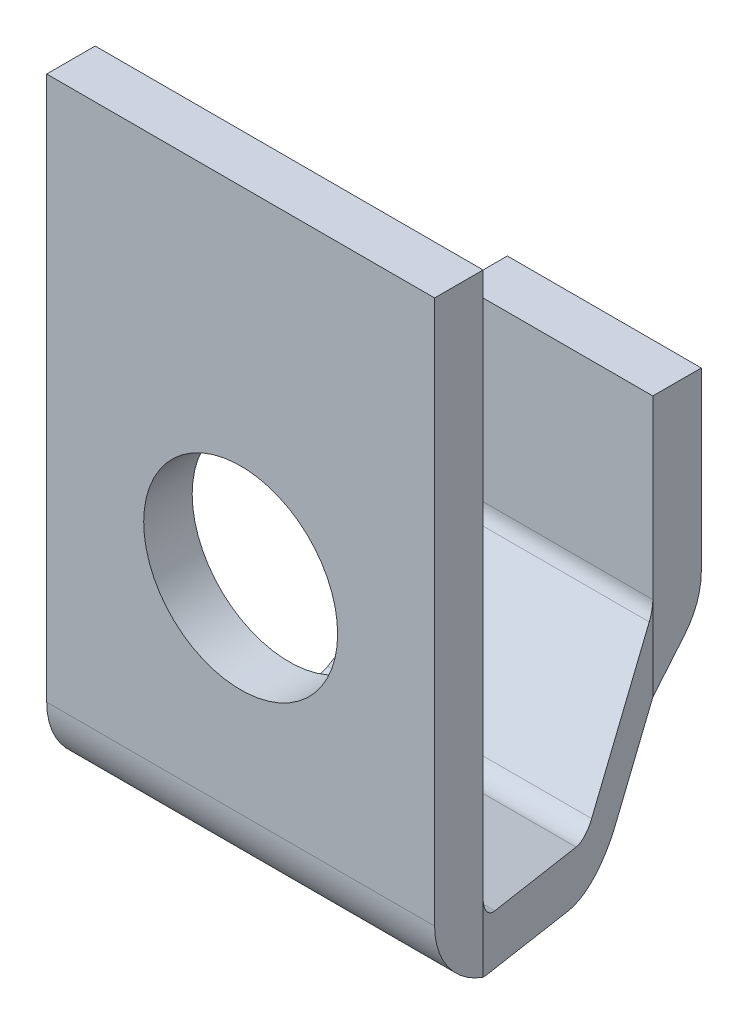
ISO-10303-21;
HEADER;
FILE_DESCRIPTION(('STEP AP214'),'2;1');
FILE_NAME('part.step','',(''),(''),'','','');
FILE_SCHEMA(('AUTOMOTIVE_DESIGN { 1 0 10303 214 1 1 1 1 }'));
ENDSEC;
DATA;
#1=APPLICATION_CONTEXT('core data for automotive mechanical design processes');
#2=APPLICATION_PROTOCOL_DEFINITION('international standard','automotive_design',2000,#1);
#3=PRODUCT_CONTEXT('',#1,'mechanical');
#4=PRODUCT('Part','Part','',(#3));
#5=PRODUCT_RELATED_PRODUCT_CATEGORY('part','',(#4));
#6=PRODUCT_DEFINITION_FORMATION('','',#4);
#7=PRODUCT_DEFINITION_CONTEXT('part definition',#1,'design');
#8=PRODUCT_DEFINITION('design','',#6,#7);
#9=PRODUCT_DEFINITION_SHAPE('','',#8);
#10=(LENGTH_UNIT() NAMED_UNIT(*) SI_UNIT(.MILLI.,.METRE.));
#11=(NAMED_UNIT(*) PLANE_ANGLE_UNIT() SI_UNIT($,.RADIAN.));
#12=(NAMED_UNIT(*) SI_UNIT($,.STERADIAN.) SOLID_ANGLE_UNIT());
#13=UNCERTAINTY_MEASURE_WITH_UNIT(LENGTH_MEASURE(1.E-05),#10,'distance_accuracy_value','');
#14=(GEOMETRIC_REPRESENTATION_CONTEXT(3) GLOBAL_UNCERTAINTY_ASSIGNED_CONTEXT((#13)) GLOBAL_UNIT_ASSIGNED_CONTEXT((#10,
#11,#12)) REPRESENTATION_CONTEXT('',''));
#15=CARTESIAN_POINT('',(0.,0.,0.));
#16=DIRECTION('',(0.,0.,1.));
#17=DIRECTION('',(1.,0.,0.));
#18=AXIS2_PLACEMENT_3D('',#15,#16,#17);
#19=CARTESIAN_POINT('',(0.,-3.,-3.25));
#20=DIRECTION('',(0.,1.,0.));
#21=DIRECTION('',(0.,0.,1.));
#22=AXIS2_PLACEMENT_3D('',#19,#20,#21);
#23=PLANE('',#22);
#24=DIRECTION('',(1.,0.,0.));
#25=VECTOR('',#24,1.);
#26=CARTESIAN_POINT('',(-2.,-3.,-3.5));
#27=LINE('',#26,#25);
#28=CARTESIAN_POINT('',(-1.,-3.,-3.5));
#29=VERTEX_POINT('',#28);
#30=CARTESIAN_POINT('',(1.,-3.,-3.5));
#31=VERTEX_POINT('',#30);
#32=EDGE_CURVE('E162',#29,#31,#27,.T.);
#33=ORIENTED_EDGE('',*,*,#32,.F.);
#34=DIRECTION('',(0.,0.,1.));
#35=VECTOR('',#34,1.);
#36=CARTESIAN_POINT('',(-1.,-3.,-3.25));
#37=LINE('',#36,#35);
#38=CARTESIAN_POINT('',(-1.,-3.,-3.));
#39=VERTEX_POINT('',#38);
#40=EDGE_CURVE('E55',#29,#39,#37,.T.);
#41=ORIENTED_EDGE('',*,*,#40,.T.);
#42=DIRECTION('',(-1.,0.,0.));
#43=VECTOR('',#42,1.);
#44=CARTESIAN_POINT('',(-2.,-3.,-3.));
#45=LINE('',#44,#43);
#46=CARTESIAN_POINT('',(1.,-3.,-3.));
#47=VERTEX_POINT('',#46);
#48=EDGE_CURVE('E167',#47,#39,#45,.T.);
#49=ORIENTED_EDGE('',*,*,#48,.F.);
#50=DIRECTION('',(0.,0.,-1.));
#51=VECTOR('',#50,1.);
#52=CARTESIAN_POINT('',(1.,-3.,-3.25));
#53=LINE('',#52,#51);
#54=EDGE_CURVE('E156',#47,#31,#53,.T.);
#55=ORIENTED_EDGE('',*,*,#54,.T.);
#56=EDGE_LOOP('',(#33,#41,#49,#55));
#57=FACE_BOUND('',#56,.T.);
#58=ADVANCED_FACE('F33',(#57),#23,.T.);
#59=CARTESIAN_POINT('',(0.,-5.60961179679779,-0.5));
#60=DIRECTION('',(1.,0.,0.));
#61=DIRECTION('',(0.,0.,-1.));
#62=AXIS2_PLACEMENT_3D('',#59,#60,#61);
#63=CYLINDRICAL_SURFACE('',#62,0.25);
#64=CARTESIAN_POINT('',(-1.90909090909091,-5.60961179679779,-0.5));
#65=DIRECTION('',(-0.939793423488437,0.,-0.341743063086704));
#66=DIRECTION('',(0.341743063086704,0.,-0.939793423488437));
#67=AXIS2_PLACEMENT_3D('',#64,#65,#66);
#68=ELLIPSE('',#67,0.26601590706181,0.25);
#69=CARTESIAN_POINT('',(-2.,-5.60961179679779,-0.25));
#70=VERTEX_POINT('',#69);
#71=CARTESIAN_POINT('',(-1.93113960227603,-5.85214742183413,-0.439366093740918));
#72=VERTEX_POINT('',#71);
#73=EDGE_CURVE('E249',#70,#72,#68,.F.);
#74=ORIENTED_EDGE('',*,*,#73,.F.);
#75=DIRECTION('',(-1.,0.,0.));
#76=VECTOR('',#75,1.);
#77=CARTESIAN_POINT('',(-2.,-5.60961179679779,-0.25));
#78=LINE('',#77,#76);
#79=CARTESIAN_POINT('',(2.,-5.60961179679779,-0.25));
#80=VERTEX_POINT('',#79);
#81=EDGE_CURVE('E225',#80,#70,#78,.T.);
#82=ORIENTED_EDGE('',*,*,#81,.F.);
#83=CARTESIAN_POINT('',(1.90909090909091,-5.60961179679779,-0.5));
#84=DIRECTION('',(0.939793423488437,0.,-0.341743063086704));
#85=DIRECTION('',(0.341743063086704,0.,0.939793423488437));
#86=AXIS2_PLACEMENT_3D('',#83,#84,#85);
#87=ELLIPSE('',#86,0.26601590706181,0.25);
#88=CARTESIAN_POINT('',(1.93113960227603,-5.85214742183413,-0.439366093740918));
#89=VERTEX_POINT('',#88);
#90=EDGE_CURVE('E267',#89,#80,#87,.F.);
#91=ORIENTED_EDGE('',*,*,#90,.F.);
#92=DIRECTION('',(-1.,0.,0.));
#93=VECTOR('',#92,1.);
#94=CARTESIAN_POINT('',(-2.,-5.85214742183413,-0.439366093740918));
#95=LINE('',#94,#93);
#96=EDGE_CURVE('E206',#89,#72,#95,.T.);
#97=ORIENTED_EDGE('',*,*,#96,.T.);
#98=EDGE_LOOP('',(#74,#82,#91,#97));
#99=FACE_BOUND('',#98,.T.);
#100=ADVANCED_FACE('F378',(#99),#63,.F.);
#101=CARTESIAN_POINT('',(0.,-5.60961179679779,-0.5));
#102=DIRECTION('',(1.,0.,0.));
#103=DIRECTION('',(0.,0.,-1.));
#104=AXIS2_PLACEMENT_3D('',#101,#102,#103);
#105=CYLINDRICAL_SURFACE('',#104,0.75);
#106=CARTESIAN_POINT('',(-1.90909090909091,-5.60961179679779,-0.5));
#107=DIRECTION('',(-0.939793423488437,0.,-0.341743063086704));
#108=DIRECTION('',(0.341743063086704,0.,-0.939793423488437));
#109=AXIS2_PLACEMENT_3D('',#106,#107,#108);
#110=ELLIPSE('',#109,0.798047721185429,0.75);
#111=CARTESIAN_POINT('',(-1.97523698864627,-6.33721867190679,-0.318098281222754));
#112=VERTEX_POINT('',#111);
#113=CARTESIAN_POINT('',(-2.,-6.31671857798434,-0.25));
#114=VERTEX_POINT('',#113);
#115=EDGE_CURVE('E240',#112,#114,#110,.T.);
#116=ORIENTED_EDGE('',*,*,#115,.F.);
#117=DIRECTION('',(1.,0.,0.));
#118=VECTOR('',#117,1.);
#119=CARTESIAN_POINT('',(-2.,-6.33721867190679,-0.318098281222754));
#120=LINE('',#119,#118);
#121=CARTESIAN_POINT('',(1.97523698864627,-6.33721867190679,-0.318098281222754));
#122=VERTEX_POINT('',#121);
#123=EDGE_CURVE('E190',#112,#122,#120,.T.);
#124=ORIENTED_EDGE('',*,*,#123,.T.);
#125=CARTESIAN_POINT('',(1.90909090909091,-5.60961179679779,-0.5));
#126=DIRECTION('',(0.939793423488437,0.,-0.341743063086704));
#127=DIRECTION('',(0.341743063086704,0.,0.939793423488437));
#128=AXIS2_PLACEMENT_3D('',#125,#126,#127);
#129=ELLIPSE('',#128,0.798047721185429,0.75);
#130=CARTESIAN_POINT('',(2.,-6.31671857798434,-0.25));
#131=VERTEX_POINT('',#130);
#132=EDGE_CURVE('E259',#131,#122,#129,.T.);
#133=ORIENTED_EDGE('',*,*,#132,.F.);
#134=CARTESIAN_POINT('',(2.,-5.60961179679779,-0.5));
#135=DIRECTION('',(1.,0.,0.));
#136=DIRECTION('',(0.,0.,1.));
#137=AXIS2_PLACEMENT_3D('',#134,#135,#136);
#138=CIRCLE('',#137,0.75);
#139=CARTESIAN_POINT('',(2.,-5.60961179679779,0.25));
#140=VERTEX_POINT('',#139);
#141=EDGE_CURVE('E197',#140,#131,#138,.T.);
#142=ORIENTED_EDGE('',*,*,#141,.F.);
#143=DIRECTION('',(1.,0.,0.));
#144=VECTOR('',#143,1.);
#145=CARTESIAN_POINT('',(-2.,-5.60961179679779,0.25));
#146=LINE('',#145,#144);
#147=CARTESIAN_POINT('',(-2.,-5.60961179679779,0.25));
#148=VERTEX_POINT('',#147);
#149=EDGE_CURVE('E194',#148,#140,#146,.T.);
#150=ORIENTED_EDGE('',*,*,#149,.F.);
#151=CARTESIAN_POINT('',(-2.,-5.60961179679779,-0.5));
#152=DIRECTION('',(1.,0.,0.));
#153=DIRECTION('',(0.,0.,1.));
#154=AXIS2_PLACEMENT_3D('',#151,#152,#153);
#155=CIRCLE('',#154,0.75);
#156=EDGE_CURVE('E193',#148,#114,#155,.T.);
#157=ORIENTED_EDGE('',*,*,#156,.T.);
#158=EDGE_LOOP('',(#116,#124,#133,#142,#150,#157));
#159=FACE_BOUND('',#158,.T.);
#160=ADVANCED_FACE('F328',(#159),#105,.T.);
#161=CARTESIAN_POINT('',(-2.,-5.85214742183413,-0.439366093740919));
#162=DIRECTION('',(0.,-0.970142500145332,0.242535625036334));
#163=DIRECTION('',(0.,-0.242535625036334,-0.970142500145332));
#164=AXIS2_PLACEMENT_3D('',#161,#162,#163);
#165=PLANE('',#164);
#166=DIRECTION('',(0.332684192827629,-0.228720382568996,-0.914881530275981));
#167=VECTOR('',#166,1.);
#168=CARTESIAN_POINT('',(-1.93876098654639,-5.84690772014826,-0.418407286997437));
#169=LINE('',#168,#167);
#170=CARTESIAN_POINT('',(-1.45230242720104,-6.18134797969818,-1.75616832519715));
#171=VERTEX_POINT('',#170);
#172=EDGE_CURVE('E251',#72,#171,#169,.T.);
#173=ORIENTED_EDGE('',*,*,#172,.F.);
#174=ORIENTED_EDGE('',*,*,#96,.F.);
#175=DIRECTION('',(0.332684192827629,0.228720382568996,0.914881530275981));
#176=VECTOR('',#175,1.);
#177=CARTESIAN_POINT('',(1.4960458979169,-6.15127434358103,-1.63587378072852));
#178=LINE('',#177,#176);
#179=CARTESIAN_POINT('',(1.45230242720104,-6.18134797969818,-1.75616832519715));
#180=VERTEX_POINT('',#179);
#181=EDGE_CURVE('E269',#180,#89,#178,.T.);
#182=ORIENTED_EDGE('',*,*,#181,.F.);
#183=DIRECTION('',(-1.,0.,0.));
#184=VECTOR('',#183,1.);
#185=CARTESIAN_POINT('',(-2.,-6.18134797969818,-1.75616832519715));
#186=LINE('',#185,#184);
#187=EDGE_CURVE('E189',#180,#171,#186,.T.);
#188=ORIENTED_EDGE('',*,*,#187,.T.);
#189=EDGE_LOOP('',(#173,#174,#182,#188));
#190=FACE_BOUND('',#189,.T.);
#191=ADVANCED_FACE('F375',(#190),#165,.F.);
#192=CARTESIAN_POINT('',(-2.,-6.33721867190679,-0.318098281222753));
#193=DIRECTION('',(0.,0.970142500145332,-0.242535625036334));
#194=DIRECTION('',(0.,0.242535625036334,0.970142500145332));
#195=AXIS2_PLACEMENT_3D('',#192,#193,#194);
#196=PLANE('',#195);
#197=DIRECTION('',(-0.332684192827629,0.228720382568996,0.914881530275981));
#198=VECTOR('',#197,1.);
#199=CARTESIAN_POINT('',(-1.97797772833782,-6.33533441336885,-0.310561247070991));
#200=LINE('',#199,#198);
#201=CARTESIAN_POINT('',(-1.49639981357128,-6.66641922977085,-1.63490051267898));
#202=VERTEX_POINT('',#201);
#203=EDGE_CURVE('E242',#202,#112,#200,.T.);
#204=ORIENTED_EDGE('',*,*,#203,.F.);
#205=DIRECTION('',(1.,0.,0.));
#206=VECTOR('',#205,1.);
#207=CARTESIAN_POINT('',(-2.,-6.66641922977085,-1.63490051267898));
#208=LINE('',#207,#206);
#209=CARTESIAN_POINT('',(1.49639981357128,-6.66641922977085,-1.63490051267898));
#210=VERTEX_POINT('',#209);
#211=EDGE_CURVE('E186',#202,#210,#208,.T.);
#212=ORIENTED_EDGE('',*,*,#211,.T.);
#213=DIRECTION('',(-0.332684192827629,-0.228720382568996,-0.914881530275981));
#214=VECTOR('',#213,1.);
#215=CARTESIAN_POINT('',(1.53526263970834,-6.63970103680162,-1.52802774080208));
#216=LINE('',#215,#214);
#217=EDGE_CURVE('E261',#122,#210,#216,.T.);
#218=ORIENTED_EDGE('',*,*,#217,.F.);
#219=ORIENTED_EDGE('',*,*,#123,.F.);
#220=EDGE_LOOP('',(#204,#212,#218,#219));
#221=FACE_BOUND('',#220,.T.);
#222=ADVANCED_FACE('F335',(#221),#196,.F.);
#223=CARTESIAN_POINT('',(0.,-5.93881235466185,-1.81680223145624));
#224=DIRECTION('',(1.,0.,0.));
#225=DIRECTION('',(0.,0.,-1.));
#226=AXIS2_PLACEMENT_3D('',#223,#224,#225);
#227=CYLINDRICAL_SURFACE('',#226,0.25);
#228=CARTESIAN_POINT('',(-1.43025373401591,-5.93881235466185,-1.81680223145624));
#229=DIRECTION('',(-0.939793423488437,0.,-0.341743063086704));
#230=DIRECTION('',(0.341743063086704,0.,-0.939793423488437));
#231=AXIS2_PLACEMENT_3D('',#228,#229,#230);
#232=ELLIPSE('',#231,0.26601590706181,0.25);
#233=CARTESIAN_POINT('',(-1.3604154358707,-6.09885845457797,-2.00885755135558));
#234=VERTEX_POINT('',#233);
#235=EDGE_CURVE('E253',#171,#234,#232,.F.);
#236=ORIENTED_EDGE('',*,*,#235,.F.);
#237=ORIENTED_EDGE('',*,*,#187,.F.);
#238=CARTESIAN_POINT('',(1.43025373401591,-5.93881235466185,-1.81680223145624));
#239=DIRECTION('',(0.939793423488437,0.,-0.341743063086704));
#240=DIRECTION('',(0.341743063086704,0.,0.939793423488437));
#241=AXIS2_PLACEMENT_3D('',#238,#239,#240);
#242=ELLIPSE('',#241,0.26601590706181,0.25);
#243=CARTESIAN_POINT('',(1.3604154358707,-6.09885845457797,-2.00885755135558));
#244=VERTEX_POINT('',#243);
#245=EDGE_CURVE('E271',#244,#180,#242,.F.);
#246=ORIENTED_EDGE('',*,*,#245,.F.);
#247=DIRECTION('',(-1.,0.,0.));
#248=VECTOR('',#247,1.);
#249=CARTESIAN_POINT('',(-2.,-6.09885845457797,-2.00885755135558));
#250=LINE('',#249,#248);
#251=EDGE_CURVE('E185',#244,#234,#250,.T.);
#252=ORIENTED_EDGE('',*,*,#251,.T.);
#253=EDGE_LOOP('',(#236,#237,#246,#252));
#254=FACE_BOUND('',#253,.T.);
#255=ADVANCED_FACE('F368',(#254),#227,.F.);
#256=CARTESIAN_POINT('',(0.,-5.93881235466185,-1.81680223145624));
#257=DIRECTION('',(1.,0.,0.));
#258=DIRECTION('',(0.,0.,-1.));
#259=AXIS2_PLACEMENT_3D('',#256,#257,#258);
#260=CYLINDRICAL_SURFACE('',#259,0.750000000000001);
#261=CARTESIAN_POINT('',(-1.43025373401591,-5.93881235466185,-1.81680223145624));
#262=DIRECTION('',(-0.939793423488437,0.,-0.341743063086704));
#263=DIRECTION('',(0.341743063086704,0.,-0.939793423488437));
#264=AXIS2_PLACEMENT_3D('',#261,#262,#263);
#265=ELLIPSE('',#264,0.79804772118543,0.750000000000001);
#266=CARTESIAN_POINT('',(-1.22073883958026,-6.41895065441021,-2.39296819115427));
#267=VERTEX_POINT('',#266);
#268=EDGE_CURVE('E244',#267,#202,#265,.T.);
#269=ORIENTED_EDGE('',*,*,#268,.F.);
#270=DIRECTION('',(1.,0.,0.));
#271=VECTOR('',#270,1.);
#272=CARTESIAN_POINT('',(-2.,-6.41895065441021,-2.39296819115427));
#273=LINE('',#272,#271);
#274=CARTESIAN_POINT('',(1.22073883958027,-6.41895065441021,-2.39296819115427));
#275=VERTEX_POINT('',#274);
#276=EDGE_CURVE('E182',#267,#275,#273,.T.);
#277=ORIENTED_EDGE('',*,*,#276,.T.);
#278=CARTESIAN_POINT('',(1.43025373401591,-5.93881235466185,-1.81680223145624));
#279=DIRECTION('',(0.939793423488437,0.,-0.341743063086704));
#280=DIRECTION('',(0.341743063086704,0.,0.939793423488437));
#281=AXIS2_PLACEMENT_3D('',#278,#279,#280);
#282=ELLIPSE('',#281,0.79804772118543,0.750000000000001);
#283=EDGE_CURVE('E263',#210,#275,#282,.T.);
#284=ORIENTED_EDGE('',*,*,#283,.F.);
#285=ORIENTED_EDGE('',*,*,#211,.F.);
#286=EDGE_LOOP('',(#269,#277,#284,#285));
#287=FACE_BOUND('',#286,.T.);
#288=ADVANCED_FACE('F342',(#287),#260,.T.);
#289=CARTESIAN_POINT('',(-2.,-6.09885845457797,-2.00885755135558));
#290=DIRECTION('',(0.,-0.64018439966448,-0.768221279597376));
#291=DIRECTION('',(0.,0.768221279597376,-0.64018439966448));
#292=AXIS2_PLACEMENT_3D('',#289,#290,#291);
#293=PLANE('',#292);
#294=DIRECTION('',(0.226731722811982,0.74821468527954,-0.62351223773295));
#295=VECTOR('',#294,1.);
#296=CARTESIAN_POINT('',(-1.39329473488775,-6.20736014133426,-1.91843947905868));
#297=LINE('',#296,#295);
#298=CARTESIAN_POINT('',(-1.02107079276387,-4.97902113232546,-2.94205531989934));
#299=VERTEX_POINT('',#298);
#300=EDGE_CURVE('E255',#234,#299,#297,.T.);
#301=ORIENTED_EDGE('',*,*,#300,.F.);
#302=ORIENTED_EDGE('',*,*,#251,.F.);
#303=DIRECTION('',(0.226731722811982,-0.74821468527954,0.62351223773295));
#304=VECTOR('',#303,1.);
#305=CARTESIAN_POINT('',(1.1876656383706,-5.52878412282764,-2.48391949448086));
#306=LINE('',#305,#304);
#307=CARTESIAN_POINT('',(1.02107079276388,-4.97902113232546,-2.94205531989934));
#308=VERTEX_POINT('',#307);
#309=EDGE_CURVE('E273',#308,#244,#306,.T.);
#310=ORIENTED_EDGE('',*,*,#309,.F.);
#311=DIRECTION('',(-1.,0.,0.));
#312=VECTOR('',#311,1.);
#313=CARTESIAN_POINT('',(-2.,-4.97902113232546,-2.94205531989934));
#314=LINE('',#313,#312);
#315=EDGE_CURVE('E181',#308,#299,#314,.T.);
#316=ORIENTED_EDGE('',*,*,#315,.T.);
#317=EDGE_LOOP('',(#301,#302,#310,#316));
#318=FACE_BOUND('',#317,.T.);
#319=ADVANCED_FACE('F365',(#318),#293,.F.);
#320=CARTESIAN_POINT('',(-2.,-6.41895065441021,-2.39296819115427));
#321=DIRECTION('',(0.,0.64018439966448,0.768221279597376));
#322=DIRECTION('',(0.,-0.768221279597376,0.64018439966448));
#323=AXIS2_PLACEMENT_3D('',#320,#321,#322);
#324=PLANE('',#323);
#325=DIRECTION('',(-0.226731722811982,-0.74821468527954,0.62351223773295));
#326=VECTOR('',#325,1.);
#327=CARTESIAN_POINT('',(-1.26079853167227,-6.55114763831383,-2.28280403790126));
#328=LINE('',#327,#326);
#329=CARTESIAN_POINT('',(-1.,-5.69051248379533,-3.));
#330=VERTEX_POINT('',#329);
#331=EDGE_CURVE('E246',#330,#267,#328,.T.);
#332=ORIENTED_EDGE('',*,*,#331,.F.);
#333=DIRECTION('',(0.,-0.768221279597376,0.64018439966448));
#334=VECTOR('',#333,1.);
#335=CARTESIAN_POINT('',(-1.,-6.41895065441021,-2.39296819115427));
#336=LINE('',#335,#334);
#337=CARTESIAN_POINT('',(-1.,-5.2991133321577,-3.32616595969803));
#338=VERTEX_POINT('',#337);
#339=EDGE_CURVE('E278',#338,#330,#336,.T.);
#340=ORIENTED_EDGE('',*,*,#339,.F.);
#341=DIRECTION('',(1.,0.,0.));
#342=VECTOR('',#341,1.);
#343=CARTESIAN_POINT('',(-2.,-5.2991133321577,-3.32616595969803));
#344=LINE('',#343,#342);
#345=CARTESIAN_POINT('',(1.,-5.2991133321577,-3.32616595969803));
#346=VERTEX_POINT('',#345);
#347=EDGE_CURVE('E178',#338,#346,#344,.T.);
#348=ORIENTED_EDGE('',*,*,#347,.T.);
#349=DIRECTION('',(0.,0.768221279597376,-0.64018439966448));
#350=VECTOR('',#349,1.);
#351=CARTESIAN_POINT('',(1.,-6.41895065441021,-2.39296819115427));
#352=LINE('',#351,#350);
#353=CARTESIAN_POINT('',(1.,-5.69051248379533,-3.));
#354=VERTEX_POINT('',#353);
#355=EDGE_CURVE('E169',#354,#346,#352,.T.);
#356=ORIENTED_EDGE('',*,*,#355,.F.);
#357=DIRECTION('',(-0.226731722811982,0.74821468527954,-0.62351223773295));
#358=VECTOR('',#357,1.);
#359=CARTESIAN_POINT('',(1.05516943515511,-5.87257161980721,-2.84828405332344));
#360=LINE('',#359,#358);
#361=EDGE_CURVE('E265',#275,#354,#360,.T.);
#362=ORIENTED_EDGE('',*,*,#361,.F.);
#363=ORIENTED_EDGE('',*,*,#276,.F.);
#364=EDGE_LOOP('',(#332,#340,#348,#356,#362,#363));
#365=FACE_BOUND('',#364,.T.);
#366=ADVANCED_FACE('F346',(#365),#324,.F.);
#367=CARTESIAN_POINT('',(0.,-4.81897503240934,-2.75));
#368=DIRECTION('',(1.,0.,0.));
#369=DIRECTION('',(0.,0.,-1.));
#370=AXIS2_PLACEMENT_3D('',#367,#368,#369);
#371=CYLINDRICAL_SURFACE('',#370,0.25);
#372=CARTESIAN_POINT('',(-1.09090909090909,-4.81897503240934,-2.75));
#373=DIRECTION('',(-0.939793423488437,0.,-0.341743063086704));
#374=DIRECTION('',(0.341743063086704,0.,-0.939793423488437));
#375=AXIS2_PLACEMENT_3D('',#372,#373,#374);
#376=ELLIPSE('',#375,0.26601590706181,0.25);
#377=CARTESIAN_POINT('',(-1.,-4.81897503240934,-3.));
#378=VERTEX_POINT('',#377);
#379=EDGE_CURVE('E257',#299,#378,#376,.F.);
#380=ORIENTED_EDGE('',*,*,#379,.F.);
#381=ORIENTED_EDGE('',*,*,#315,.F.);
#382=CARTESIAN_POINT('',(1.09090909090909,-4.81897503240934,-2.75));
#383=DIRECTION('',(0.939793423488437,0.,-0.341743063086704));
#384=DIRECTION('',(0.341743063086704,0.,0.939793423488437));
#385=AXIS2_PLACEMENT_3D('',#382,#383,#384);
#386=ELLIPSE('',#385,0.26601590706181,0.25);
#387=CARTESIAN_POINT('',(1.,-4.81897503240934,-3.));
#388=VERTEX_POINT('',#387);
#389=EDGE_CURVE('E275',#388,#308,#386,.F.);
#390=ORIENTED_EDGE('',*,*,#389,.F.);
#391=DIRECTION('',(-1.,0.,0.));
#392=VECTOR('',#391,1.);
#393=CARTESIAN_POINT('',(-2.,-4.81897503240934,-3.));
#394=LINE('',#393,#392);
#395=EDGE_CURVE('E177',#388,#378,#394,.T.);
#396=ORIENTED_EDGE('',*,*,#395,.T.);
#397=EDGE_LOOP('',(#380,#381,#390,#396));
#398=FACE_BOUND('',#397,.T.);
#399=ADVANCED_FACE('F358',(#398),#371,.F.);
#400=CARTESIAN_POINT('',(0.,-4.81897503240934,-2.75));
#401=DIRECTION('',(1.,0.,0.));
#402=DIRECTION('',(0.,0.,-1.));
#403=AXIS2_PLACEMENT_3D('',#400,#401,#402);
#404=CYLINDRICAL_SURFACE('',#403,0.75);
#405=CARTESIAN_POINT('',(-1.,-4.81897503240934,-2.75));
#406=DIRECTION('',(-1.,0.,0.));
#407=DIRECTION('',(0.,0.,1.));
#408=AXIS2_PLACEMENT_3D('',#405,#406,#407);
#409=CIRCLE('',#408,0.75);
#410=CARTESIAN_POINT('',(-1.,-4.81897503240934,-3.5));
#411=VERTEX_POINT('',#410);
#412=EDGE_CURVE('E168',#411,#338,#409,.T.);
#413=ORIENTED_EDGE('',*,*,#412,.F.);
#414=DIRECTION('',(1.,0.,0.));
#415=VECTOR('',#414,1.);
#416=CARTESIAN_POINT('',(-2.,-4.81897503240934,-3.5));
#417=LINE('',#416,#415);
#418=CARTESIAN_POINT('',(1.,-4.81897503240934,-3.5));
#419=VERTEX_POINT('',#418);
#420=EDGE_CURVE('E173',#411,#419,#417,.T.);
#421=ORIENTED_EDGE('',*,*,#420,.T.);
#422=CARTESIAN_POINT('',(1.,-4.81897503240934,-2.75));
#423=DIRECTION('',(1.,0.,0.));
#424=DIRECTION('',(0.,0.,-1.));
#425=AXIS2_PLACEMENT_3D('',#422,#423,#424);
#426=CIRCLE('',#425,0.75);
#427=EDGE_CURVE('E48',#346,#419,#426,.T.);
#428=ORIENTED_EDGE('',*,*,#427,.F.);
#429=ORIENTED_EDGE('',*,*,#347,.F.);
#430=EDGE_LOOP('',(#413,#421,#428,#429));
#431=FACE_BOUND('',#430,.T.);
#432=ADVANCED_FACE('F396',(#431),#404,.T.);
#433=CARTESIAN_POINT('',(-2.,-4.81897503240934,-3.));
#434=DIRECTION('',(0.,0.,-1.));
#435=DIRECTION('',(0.,1.,0.));
#436=AXIS2_PLACEMENT_3D('',#433,#434,#435);
#437=PLANE('',#436);
#438=DIRECTION('',(0.,1.,0.));
#439=VECTOR('',#438,1.);
#440=CARTESIAN_POINT('',(-1.,-6.68881235466185,-3.));
#441=LINE('',#440,#439);
#442=EDGE_CURVE('E291',#378,#39,#441,.T.);
#443=ORIENTED_EDGE('',*,*,#442,.F.);
#444=ORIENTED_EDGE('',*,*,#395,.F.);
#445=DIRECTION('',(0.,1.,0.));
#446=VECTOR('',#445,1.);
#447=CARTESIAN_POINT('',(1.,-6.68881235466185,-3.));
#448=LINE('',#447,#446);
#449=EDGE_CURVE('E287',#388,#47,#448,.T.);
#450=ORIENTED_EDGE('',*,*,#449,.T.);
#451=ORIENTED_EDGE('',*,*,#48,.T.);
#452=EDGE_LOOP('',(#443,#444,#450,#451));
#453=FACE_BOUND('',#452,.T.);
#454=ADVANCED_FACE('F355',(#453),#437,.F.);
#455=CARTESIAN_POINT('',(-2.,-4.81897503240934,-3.5));
#456=DIRECTION('',(0.,0.,1.));
#457=DIRECTION('',(0.,-1.,0.));
#458=AXIS2_PLACEMENT_3D('',#455,#456,#457);
#459=PLANE('',#458);
#460=DIRECTION('',(0.,-1.,0.));
#461=VECTOR('',#460,1.);
#462=CARTESIAN_POINT('',(-1.,-4.81897503240934,-3.5));
#463=LINE('',#462,#461);
#464=EDGE_CURVE('E12',#29,#411,#463,.T.);
#465=ORIENTED_EDGE('',*,*,#464,.F.);
#466=ORIENTED_EDGE('',*,*,#32,.T.);
#467=DIRECTION('',(0.,1.,0.));
#468=VECTOR('',#467,1.);
#469=CARTESIAN_POINT('',(1.,-4.81897503240934,-3.5));
#470=LINE('',#469,#468);
#471=EDGE_CURVE('E41',#419,#31,#470,.T.);
#472=ORIENTED_EDGE('',*,*,#471,.F.);
#473=ORIENTED_EDGE('',*,*,#420,.F.);
#474=EDGE_LOOP('',(#465,#466,#472,#473));
#475=FACE_BOUND('',#474,.T.);
#476=ADVANCED_FACE('F171',(#475),#459,.F.);
#477=CARTESIAN_POINT('',(0.,0.,0.));
#478=DIRECTION('',(0.,-1.,0.));
#479=DIRECTION('',(0.,0.,-1.));
#480=AXIS2_PLACEMENT_3D('',#477,#478,#479);
#481=PLANE('',#480);
#482=DIRECTION('',(0.,0.,-1.));
#483=VECTOR('',#482,1.);
#484=CARTESIAN_POINT('',(2.,0.,0.25));
#485=LINE('',#484,#483);
#486=CARTESIAN_POINT('',(2.,0.,0.25));
#487=VERTEX_POINT('',#486);
#488=CARTESIAN_POINT('',(2.,0.,-0.25));
#489=VERTEX_POINT('',#488);
#490=EDGE_CURVE('E231',#487,#489,#485,.T.);
#491=ORIENTED_EDGE('',*,*,#490,.T.);
#492=DIRECTION('',(-1.,0.,0.));
#493=VECTOR('',#492,1.);
#494=CARTESIAN_POINT('',(-2.,0.,-0.25));
#495=LINE('',#494,#493);
#496=CARTESIAN_POINT('',(-2.,0.,-0.25));
#497=VERTEX_POINT('',#496);
#498=EDGE_CURVE('E211',#489,#497,#495,.T.);
#499=ORIENTED_EDGE('',*,*,#498,.T.);
#500=DIRECTION('',(0.,0.,1.));
#501=VECTOR('',#500,1.);
#502=CARTESIAN_POINT('',(-2.,0.,0.25));
#503=LINE('',#502,#501);
#504=CARTESIAN_POINT('',(-2.,0.,0.25));
#505=VERTEX_POINT('',#504);
#506=EDGE_CURVE('E203',#497,#505,#503,.T.);
#507=ORIENTED_EDGE('',*,*,#506,.T.);
#508=DIRECTION('',(1.,0.,0.));
#509=VECTOR('',#508,1.);
#510=CARTESIAN_POINT('',(-2.,0.,0.25));
#511=LINE('',#510,#509);
#512=EDGE_CURVE('E199',#505,#487,#511,.T.);
#513=ORIENTED_EDGE('',*,*,#512,.T.);
#514=EDGE_LOOP('',(#491,#499,#507,#513));
#515=FACE_BOUND('',#514,.T.);
#516=ADVANCED_FACE('F35',(#515),#481,.F.);
#517=CARTESIAN_POINT('',(2.,0.,0.25));
#518=DIRECTION('',(-1.,0.,0.));
#519=DIRECTION('',(0.,0.,1.));
#520=AXIS2_PLACEMENT_3D('',#517,#518,#519);
#521=PLANE('',#520);
#522=DIRECTION('',(0.,-1.,0.));
#523=VECTOR('',#522,1.);
#524=CARTESIAN_POINT('',(2.,0.,-0.25));
#525=LINE('',#524,#523);
#526=EDGE_CURVE('E228',#489,#80,#525,.T.);
#527=ORIENTED_EDGE('',*,*,#526,.F.);
#528=ORIENTED_EDGE('',*,*,#490,.F.);
#529=DIRECTION('',(0.,-1.,0.));
#530=VECTOR('',#529,1.);
#531=CARTESIAN_POINT('',(2.,0.,0.25));
#532=LINE('',#531,#530);
#533=EDGE_CURVE('E202',#487,#140,#532,.T.);
#534=ORIENTED_EDGE('',*,*,#533,.T.);
#535=ORIENTED_EDGE('',*,*,#141,.T.);
#536=DIRECTION('',(0.,1.,0.));
#537=VECTOR('',#536,1.);
#538=CARTESIAN_POINT('',(2.,-6.68881235466185,-0.25));
#539=LINE('',#538,#537);
#540=EDGE_CURVE('E284',#131,#80,#539,.T.);
#541=ORIENTED_EDGE('',*,*,#540,.T.);
#542=EDGE_LOOP('',(#527,#528,#534,#535,#541));
#543=FACE_BOUND('',#542,.T.);
#544=ADVANCED_FACE('F322',(#543),#521,.F.);
#545=CARTESIAN_POINT('',(-2.,0.,-0.25));
#546=DIRECTION('',(0.,0.,1.));
#547=DIRECTION('',(1.,0.,0.));
#548=AXIS2_PLACEMENT_3D('',#545,#546,#547);
#549=PLANE('',#548);
#550=CARTESIAN_POINT('',(0.,-3.5,-0.25));
#551=DIRECTION('',(0.,0.,1.));
#552=DIRECTION('',(1.,0.,0.));
#553=AXIS2_PLACEMENT_3D('',#550,#551,#552);
#554=CIRCLE('',#553,1.);
#555=CARTESIAN_POINT('',(1.,-3.5,-0.25));
#556=VERTEX_POINT('',#555);
#557=EDGE_CURVE('E288',#556,#556,#554,.T.);
#558=ORIENTED_EDGE('',*,*,#557,.T.);
#559=EDGE_LOOP('',(#558));
#560=FACE_BOUND('',#559,.T.);
#561=DIRECTION('',(0.,-1.,0.));
#562=VECTOR('',#561,1.);
#563=CARTESIAN_POINT('',(-2.,0.,-0.25));
#564=LINE('',#563,#562);
#565=EDGE_CURVE('E209',#497,#70,#564,.T.);
#566=ORIENTED_EDGE('',*,*,#565,.F.);
#567=ORIENTED_EDGE('',*,*,#498,.F.);
#568=ORIENTED_EDGE('',*,*,#526,.T.);
#569=ORIENTED_EDGE('',*,*,#81,.T.);
#570=EDGE_LOOP('',(#566,#567,#568,#569));
#571=FACE_BOUND('',#570,.T.);
#572=ADVANCED_FACE('F301',(#560,#571),#549,.F.);
#573=CARTESIAN_POINT('',(-2.,0.,0.25));
#574=DIRECTION('',(1.,0.,0.));
#575=DIRECTION('',(0.,0.,-1.));
#576=AXIS2_PLACEMENT_3D('',#573,#574,#575);
#577=PLANE('',#576);
#578=DIRECTION('',(0.,-1.,0.));
#579=VECTOR('',#578,1.);
#580=CARTESIAN_POINT('',(-2.,0.,0.25));
#581=LINE('',#580,#579);
#582=EDGE_CURVE('E198',#505,#148,#581,.T.);
#583=ORIENTED_EDGE('',*,*,#582,.F.);
#584=ORIENTED_EDGE('',*,*,#506,.F.);
#585=ORIENTED_EDGE('',*,*,#565,.T.);
#586=DIRECTION('',(0.,1.,0.));
#587=VECTOR('',#586,1.);
#588=CARTESIAN_POINT('',(-2.,-6.68881235466185,-0.25));
#589=LINE('',#588,#587);
#590=EDGE_CURVE('E283',#114,#70,#589,.T.);
#591=ORIENTED_EDGE('',*,*,#590,.F.);
#592=ORIENTED_EDGE('',*,*,#156,.F.);
#593=EDGE_LOOP('',(#583,#584,#585,#591,#592));
#594=FACE_BOUND('',#593,.T.);
#595=ADVANCED_FACE('F314',(#594),#577,.F.);
#596=CARTESIAN_POINT('',(-2.,0.,0.25));
#597=DIRECTION('',(0.,0.,-1.));
#598=DIRECTION('',(-1.,0.,0.));
#599=AXIS2_PLACEMENT_3D('',#596,#597,#598);
#600=PLANE('',#599);
#601=CARTESIAN_POINT('',(0.,-3.5,0.25));
#602=DIRECTION('',(0.,0.,1.));
#603=DIRECTION('',(1.,0.,0.));
#604=AXIS2_PLACEMENT_3D('',#601,#602,#603);
#605=CIRCLE('',#604,1.);
#606=CARTESIAN_POINT('',(1.,-3.5,0.25));
#607=VERTEX_POINT('',#606);
#608=EDGE_CURVE('E295',#607,#607,#605,.T.);
#609=ORIENTED_EDGE('',*,*,#608,.F.);
#610=EDGE_LOOP('',(#609));
#611=FACE_BOUND('',#610,.T.);
#612=ORIENTED_EDGE('',*,*,#149,.T.);
#613=ORIENTED_EDGE('',*,*,#533,.F.);
#614=ORIENTED_EDGE('',*,*,#512,.F.);
#615=ORIENTED_EDGE('',*,*,#582,.T.);
#616=EDGE_LOOP('',(#612,#613,#614,#615));
#617=FACE_BOUND('',#616,.T.);
#618=ADVANCED_FACE('F311',(#611,#617),#600,.F.);
#619=CARTESIAN_POINT('',(1.,-6.68881235466185,-3.5));
#620=DIRECTION('',(1.,0.,0.));
#621=DIRECTION('',(0.,0.,-1.));
#622=AXIS2_PLACEMENT_3D('',#619,#620,#621);
#623=PLANE('',#622);
#624=ORIENTED_EDGE('',*,*,#449,.F.);
#625=EDGE_CURVE('E290',#354,#388,#448,.T.);
#626=ORIENTED_EDGE('',*,*,#625,.F.);
#627=ORIENTED_EDGE('',*,*,#355,.T.);
#628=ORIENTED_EDGE('',*,*,#427,.T.);
#629=ORIENTED_EDGE('',*,*,#471,.T.);
#630=ORIENTED_EDGE('',*,*,#54,.F.);
#631=EDGE_LOOP('',(#624,#626,#627,#628,#629,#630));
#632=FACE_BOUND('',#631,.T.);
#633=ADVANCED_FACE('F155',(#632),#623,.T.);
#634=CARTESIAN_POINT('',(1.,-6.68881235466185,-3.));
#635=DIRECTION('',(0.939793423488437,0.,-0.341743063086704));
#636=DIRECTION('',(-0.341743063086704,0.,-0.939793423488437));
#637=AXIS2_PLACEMENT_3D('',#634,#635,#636);
#638=PLANE('',#637);
#639=ORIENTED_EDGE('',*,*,#132,.T.);
#640=ORIENTED_EDGE('',*,*,#217,.T.);
#641=ORIENTED_EDGE('',*,*,#283,.T.);
#642=ORIENTED_EDGE('',*,*,#361,.T.);
#643=ORIENTED_EDGE('',*,*,#625,.T.);
#644=ORIENTED_EDGE('',*,*,#389,.T.);
#645=ORIENTED_EDGE('',*,*,#309,.T.);
#646=ORIENTED_EDGE('',*,*,#245,.T.);
#647=ORIENTED_EDGE('',*,*,#181,.T.);
#648=ORIENTED_EDGE('',*,*,#90,.T.);
#649=ORIENTED_EDGE('',*,*,#540,.F.);
#650=EDGE_LOOP('',(#639,#640,#641,#642,#643,#644,#645,#646,#647,#648,#649));
#651=FACE_BOUND('',#650,.T.);
#652=ADVANCED_FACE('F339',(#651),#638,.T.);
#653=CARTESIAN_POINT('',(-2.,-6.68881235466185,-0.25));
#654=DIRECTION('',(-0.939793423488437,0.,-0.341743063086704));
#655=DIRECTION('',(-0.341743063086704,0.,0.939793423488437));
#656=AXIS2_PLACEMENT_3D('',#653,#654,#655);
#657=PLANE('',#656);
#658=ORIENTED_EDGE('',*,*,#115,.T.);
#659=ORIENTED_EDGE('',*,*,#590,.T.);
#660=ORIENTED_EDGE('',*,*,#73,.T.);
#661=ORIENTED_EDGE('',*,*,#172,.T.);
#662=ORIENTED_EDGE('',*,*,#235,.T.);
#663=ORIENTED_EDGE('',*,*,#300,.T.);
#664=ORIENTED_EDGE('',*,*,#379,.T.);
#665=EDGE_CURVE('E293',#330,#378,#441,.T.);
#666=ORIENTED_EDGE('',*,*,#665,.F.);
#667=ORIENTED_EDGE('',*,*,#331,.T.);
#668=ORIENTED_EDGE('',*,*,#268,.T.);
#669=ORIENTED_EDGE('',*,*,#203,.T.);
#670=EDGE_LOOP('',(#658,#659,#660,#661,#662,#663,#664,#666,#667,#668,#669));
#671=FACE_BOUND('',#670,.T.);
#672=ADVANCED_FACE('F492',(#671),#657,.T.);
#673=CARTESIAN_POINT('',(-1.,-6.68881235466185,-3.));
#674=DIRECTION('',(-1.,0.,0.));
#675=DIRECTION('',(0.,0.,1.));
#676=AXIS2_PLACEMENT_3D('',#673,#674,#675);
#677=PLANE('',#676);
#678=ORIENTED_EDGE('',*,*,#464,.T.);
#679=ORIENTED_EDGE('',*,*,#412,.T.);
#680=ORIENTED_EDGE('',*,*,#339,.T.);
#681=ORIENTED_EDGE('',*,*,#665,.T.);
#682=ORIENTED_EDGE('',*,*,#442,.T.);
#683=ORIENTED_EDGE('',*,*,#40,.F.);
#684=EDGE_LOOP('',(#678,#679,#680,#681,#682,#683));
#685=FACE_BOUND('',#684,.T.);
#686=ADVANCED_FACE('F307',(#685),#677,.T.);
#687=CARTESIAN_POINT('',(0.,-3.5,-0.25));
#688=DIRECTION('',(0.,0.,1.));
#689=DIRECTION('',(1.,0.,0.));
#690=AXIS2_PLACEMENT_3D('',#687,#688,#689);
#691=CYLINDRICAL_SURFACE('',#690,1.);
#692=ORIENTED_EDGE('',*,*,#557,.F.);
#693=EDGE_LOOP('',(#692));
#694=FACE_BOUND('',#693,.T.);
#695=ORIENTED_EDGE('',*,*,#608,.T.);
#696=EDGE_LOOP('',(#695));
#697=FACE_BOUND('',#696,.T.);
#698=ADVANCED_FACE('F304',(#694,#697),#691,.F.);
#699=CLOSED_SHELL('',(#58,#100,#160,#191,#222,#255,#288,#319,#366,#399,#432,#454,#476,#516,#544,
#572,#595,#618,#633,#652,#672,#686,#698));
#700=MANIFOLD_SOLID_BREP('B2',#699);
#701=ADVANCED_BREP_SHAPE_REPRESENTATION('',(#18,#700),#14);
#702=SHAPE_DEFINITION_REPRESENTATION(#9,#701);
ENDSEC;
END-ISO-10303-21;
